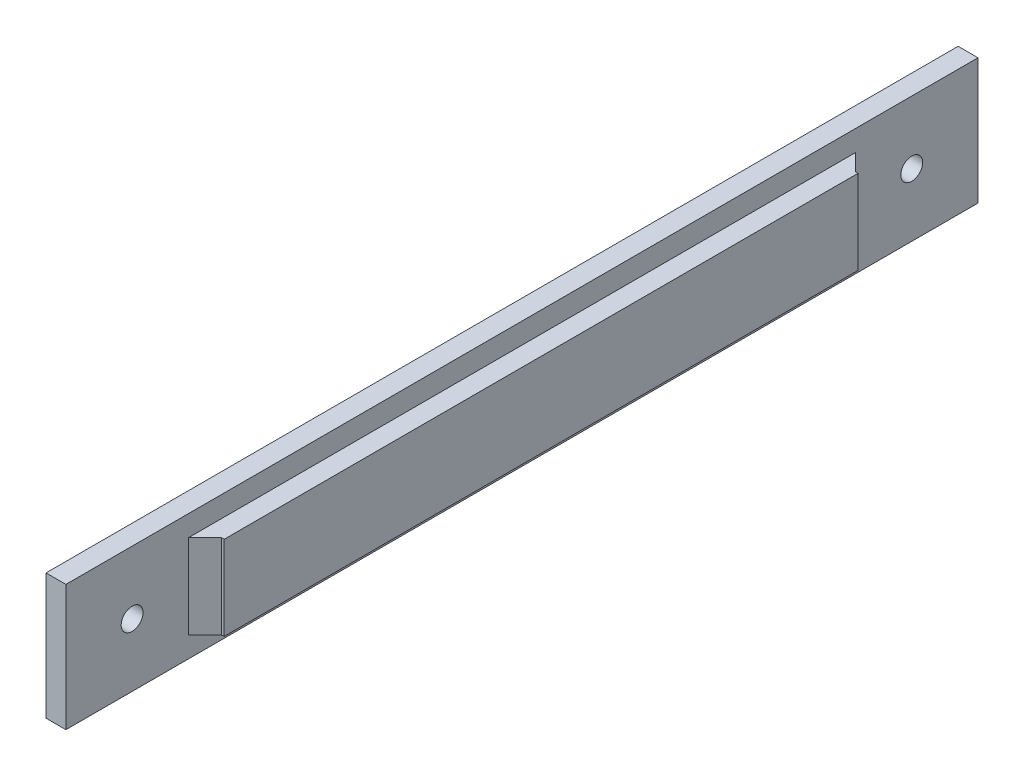
ISO-10303-21;
HEADER;
FILE_DESCRIPTION(('STEP AP214'),'2;1');
FILE_NAME('part.step','',(''),(''),'','','');
FILE_SCHEMA(('AUTOMOTIVE_DESIGN { 1 0 10303 214 1 1 1 1 }'));
ENDSEC;
DATA;
#1=APPLICATION_CONTEXT('core data for automotive mechanical design processes');
#2=APPLICATION_PROTOCOL_DEFINITION('international standard','automotive_design',2000,#1);
#3=PRODUCT_CONTEXT('',#1,'mechanical');
#4=PRODUCT('Part','Part','',(#3));
#5=PRODUCT_RELATED_PRODUCT_CATEGORY('part','',(#4));
#6=PRODUCT_DEFINITION_FORMATION('','',#4);
#7=PRODUCT_DEFINITION_CONTEXT('part definition',#1,'design');
#8=PRODUCT_DEFINITION('design','',#6,#7);
#9=PRODUCT_DEFINITION_SHAPE('','',#8);
#10=(LENGTH_UNIT() NAMED_UNIT(*) SI_UNIT(.MILLI.,.METRE.));
#11=(NAMED_UNIT(*) PLANE_ANGLE_UNIT() SI_UNIT($,.RADIAN.));
#12=(NAMED_UNIT(*) SI_UNIT($,.STERADIAN.) SOLID_ANGLE_UNIT());
#13=UNCERTAINTY_MEASURE_WITH_UNIT(LENGTH_MEASURE(1.E-05),#10,'distance_accuracy_value','');
#14=(GEOMETRIC_REPRESENTATION_CONTEXT(3) GLOBAL_UNCERTAINTY_ASSIGNED_CONTEXT((#13)) GLOBAL_UNIT_ASSIGNED_CONTEXT((#10,
#11,#12)) REPRESENTATION_CONTEXT('',''));
#15=CARTESIAN_POINT('',(0.,0.,0.));
#16=DIRECTION('',(0.,0.,1.));
#17=DIRECTION('',(1.,0.,0.));
#18=AXIS2_PLACEMENT_3D('',#15,#16,#17);
#19=CARTESIAN_POINT('',(0.,0.,137.7));
#20=DIRECTION('',(0.,0.,1.));
#21=DIRECTION('',(1.,0.,0.));
#22=AXIS2_PLACEMENT_3D('',#19,#20,#21);
#23=PLANE('',#22);
#24=DIRECTION('',(1.,0.,0.));
#25=VECTOR('',#24,1.);
#26=CARTESIAN_POINT('',(0.,-3.,137.7));
#27=LINE('',#26,#25);
#28=CARTESIAN_POINT('',(-3.,-3.,137.7));
#29=VERTEX_POINT('',#28);
#30=CARTESIAN_POINT('',(0.,-3.,137.7));
#31=VERTEX_POINT('',#30);
#32=EDGE_CURVE('E192',#29,#31,#27,.T.);
#33=ORIENTED_EDGE('',*,*,#32,.T.);
#34=DIRECTION('',(0.,-1.,0.));
#35=VECTOR('',#34,1.);
#36=CARTESIAN_POINT('',(0.,0.,137.7));
#37=LINE('',#36,#35);
#38=CARTESIAN_POINT('',(0.,16.,137.7));
#39=VERTEX_POINT('',#38);
#40=EDGE_CURVE('E185',#39,#31,#37,.T.);
#41=ORIENTED_EDGE('',*,*,#40,.F.);
#42=DIRECTION('',(-1.,0.,0.));
#43=VECTOR('',#42,1.);
#44=CARTESIAN_POINT('',(0.,16.,137.7));
#45=LINE('',#44,#43);
#46=CARTESIAN_POINT('',(-3.,16.,137.7));
#47=VERTEX_POINT('',#46);
#48=EDGE_CURVE('E196',#39,#47,#45,.T.);
#49=ORIENTED_EDGE('',*,*,#48,.T.);
#50=DIRECTION('',(0.,-1.,0.));
#51=VECTOR('',#50,1.);
#52=CARTESIAN_POINT('',(-3.,0.,137.7));
#53=LINE('',#52,#51);
#54=EDGE_CURVE('E189',#47,#29,#53,.T.);
#55=ORIENTED_EDGE('',*,*,#54,.T.);
#56=EDGE_LOOP('',(#33,#41,#49,#55));
#57=FACE_BOUND('',#56,.T.);
#58=ADVANCED_FACE('F62',(#57),#23,.T.);
#59=CARTESIAN_POINT('',(0.,0.,0.));
#60=DIRECTION('',(0.,0.,1.));
#61=DIRECTION('',(1.,0.,0.));
#62=AXIS2_PLACEMENT_3D('',#59,#60,#61);
#63=PLANE('',#62);
#64=DIRECTION('',(0.,-1.,0.));
#65=VECTOR('',#64,1.);
#66=CARTESIAN_POINT('',(0.,0.,0.));
#67=LINE('',#66,#65);
#68=CARTESIAN_POINT('',(0.,16.,0.));
#69=VERTEX_POINT('',#68);
#70=CARTESIAN_POINT('',(0.,-3.,0.));
#71=VERTEX_POINT('',#70);
#72=EDGE_CURVE('E184',#69,#71,#67,.T.);
#73=ORIENTED_EDGE('',*,*,#72,.T.);
#74=DIRECTION('',(1.,0.,0.));
#75=VECTOR('',#74,1.);
#76=CARTESIAN_POINT('',(0.,-3.,0.));
#77=LINE('',#76,#75);
#78=CARTESIAN_POINT('',(-3.,-3.,0.));
#79=VERTEX_POINT('',#78);
#80=EDGE_CURVE('E201',#79,#71,#77,.T.);
#81=ORIENTED_EDGE('',*,*,#80,.F.);
#82=DIRECTION('',(0.,-1.,0.));
#83=VECTOR('',#82,1.);
#84=CARTESIAN_POINT('',(-3.,0.,0.));
#85=LINE('',#84,#83);
#86=CARTESIAN_POINT('',(-3.,16.,0.));
#87=VERTEX_POINT('',#86);
#88=EDGE_CURVE('E187',#87,#79,#85,.T.);
#89=ORIENTED_EDGE('',*,*,#88,.F.);
#90=DIRECTION('',(-1.,0.,0.));
#91=VECTOR('',#90,1.);
#92=CARTESIAN_POINT('',(0.,16.,0.));
#93=LINE('',#92,#91);
#94=EDGE_CURVE('E193',#69,#87,#93,.T.);
#95=ORIENTED_EDGE('',*,*,#94,.F.);
#96=EDGE_LOOP('',(#73,#81,#89,#95));
#97=FACE_BOUND('',#96,.T.);
#98=ADVANCED_FACE('F253',(#97),#63,.F.);
#99=CARTESIAN_POINT('',(0.,-3.,137.7));
#100=DIRECTION('',(0.,1.,0.));
#101=DIRECTION('',(0.,0.,1.));
#102=AXIS2_PLACEMENT_3D('',#99,#100,#101);
#103=PLANE('',#102);
#104=DIRECTION('',(0.,0.,-1.));
#105=VECTOR('',#104,1.);
#106=CARTESIAN_POINT('',(0.,-3.,137.7));
#107=LINE('',#106,#105);
#108=EDGE_CURVE('E161',#31,#71,#107,.T.);
#109=ORIENTED_EDGE('',*,*,#108,.F.);
#110=ORIENTED_EDGE('',*,*,#32,.F.);
#111=DIRECTION('',(0.,0.,-1.));
#112=VECTOR('',#111,1.);
#113=CARTESIAN_POINT('',(-3.,-3.,137.7));
#114=LINE('',#113,#112);
#115=EDGE_CURVE('E207',#29,#79,#114,.T.);
#116=ORIENTED_EDGE('',*,*,#115,.T.);
#117=ORIENTED_EDGE('',*,*,#80,.T.);
#118=EDGE_LOOP('',(#109,#110,#116,#117));
#119=FACE_BOUND('',#118,.T.);
#120=ADVANCED_FACE('F259',(#119),#103,.F.);
#121=CARTESIAN_POINT('',(0.,16.,137.7));
#122=DIRECTION('',(0.,-1.,0.));
#123=DIRECTION('',(0.,0.,-1.));
#124=AXIS2_PLACEMENT_3D('',#121,#122,#123);
#125=PLANE('',#124);
#126=DIRECTION('',(0.,0.,1.));
#127=VECTOR('',#126,1.);
#128=CARTESIAN_POINT('',(0.,16.,137.7));
#129=LINE('',#128,#127);
#130=EDGE_CURVE('E164',#69,#39,#129,.T.);
#131=ORIENTED_EDGE('',*,*,#130,.F.);
#132=ORIENTED_EDGE('',*,*,#94,.T.);
#133=DIRECTION('',(0.,0.,-1.));
#134=VECTOR('',#133,1.);
#135=CARTESIAN_POINT('',(-3.,16.,137.7));
#136=LINE('',#135,#134);
#137=EDGE_CURVE('E198',#47,#87,#136,.T.);
#138=ORIENTED_EDGE('',*,*,#137,.F.);
#139=ORIENTED_EDGE('',*,*,#48,.F.);
#140=EDGE_LOOP('',(#131,#132,#138,#139));
#141=FACE_BOUND('',#140,.T.);
#142=ADVANCED_FACE('F265',(#141),#125,.F.);
#143=CARTESIAN_POINT('',(-3.,0.,137.7));
#144=DIRECTION('',(1.,0.,0.));
#145=DIRECTION('',(0.,0.,-1.));
#146=AXIS2_PLACEMENT_3D('',#143,#144,#145);
#147=PLANE('',#146);
#148=CARTESIAN_POINT('',(-3.,6.5,10.));
#149=DIRECTION('',(-1.,0.,0.));
#150=DIRECTION('',(0.,0.,1.));
#151=AXIS2_PLACEMENT_3D('',#148,#149,#150);
#152=CIRCLE('',#151,1.65);
#153=CARTESIAN_POINT('',(-3.,6.5,11.65));
#154=VERTEX_POINT('',#153);
#155=EDGE_CURVE('E173',#154,#154,#152,.T.);
#156=ORIENTED_EDGE('',*,*,#155,.F.);
#157=EDGE_LOOP('',(#156));
#158=FACE_BOUND('',#157,.T.);
#159=CARTESIAN_POINT('',(-3.,6.5,127.7));
#160=DIRECTION('',(-1.,0.,0.));
#161=DIRECTION('',(0.,0.,1.));
#162=AXIS2_PLACEMENT_3D('',#159,#160,#161);
#163=CIRCLE('',#162,1.65000000000002);
#164=CARTESIAN_POINT('',(-3.,6.5,129.35));
#165=VERTEX_POINT('',#164);
#166=EDGE_CURVE('E172',#165,#165,#163,.T.);
#167=ORIENTED_EDGE('',*,*,#166,.F.);
#168=EDGE_LOOP('',(#167));
#169=FACE_BOUND('',#168,.T.);
#170=ORIENTED_EDGE('',*,*,#88,.T.);
#171=ORIENTED_EDGE('',*,*,#115,.F.);
#172=ORIENTED_EDGE('',*,*,#54,.F.);
#173=ORIENTED_EDGE('',*,*,#137,.T.);
#174=EDGE_LOOP('',(#170,#171,#172,#173));
#175=FACE_BOUND('',#174,.T.);
#176=ADVANCED_FACE('F268',(#158,#169,#175),#147,.F.);
#177=CARTESIAN_POINT('',(0.,0.,137.7));
#178=DIRECTION('',(1.,0.,0.));
#179=DIRECTION('',(0.,0.,-1.));
#180=AXIS2_PLACEMENT_3D('',#177,#178,#179);
#181=PLANE('',#180);
#182=DIRECTION('',(0.,0.,1.));
#183=VECTOR('',#182,1.);
#184=CARTESIAN_POINT('',(0.,12.85,116.7));
#185=LINE('',#184,#183);
#186=CARTESIAN_POINT('',(0.,12.85,18.5));
#187=VERTEX_POINT('',#186);
#188=CARTESIAN_POINT('',(0.,12.85,119.2));
#189=VERTEX_POINT('',#188);
#190=EDGE_CURVE('E157',#187,#189,#185,.T.);
#191=ORIENTED_EDGE('',*,*,#190,.F.);
#192=DIRECTION('',(0.,-1.,0.));
#193=VECTOR('',#192,1.);
#194=CARTESIAN_POINT('',(0.,0.,18.5));
#195=LINE('',#194,#193);
#196=CARTESIAN_POINT('',(0.,0.15000000000002,18.5));
#197=VERTEX_POINT('',#196);
#198=EDGE_CURVE('E216',#187,#197,#195,.T.);
#199=ORIENTED_EDGE('',*,*,#198,.T.);
#200=DIRECTION('',(0.,0.,-1.));
#201=VECTOR('',#200,1.);
#202=CARTESIAN_POINT('',(0.,0.14999999999997,116.7));
#203=LINE('',#202,#201);
#204=CARTESIAN_POINT('',(0.,0.149999999999968,119.2));
#205=VERTEX_POINT('',#204);
#206=EDGE_CURVE('E224',#205,#197,#203,.T.);
#207=ORIENTED_EDGE('',*,*,#206,.F.);
#208=DIRECTION('',(0.,1.,0.));
#209=VECTOR('',#208,1.);
#210=CARTESIAN_POINT('',(0.,0.,119.2));
#211=LINE('',#210,#209);
#212=EDGE_CURVE('E213',#205,#189,#211,.T.);
#213=ORIENTED_EDGE('',*,*,#212,.T.);
#214=EDGE_LOOP('',(#191,#199,#207,#213));
#215=FACE_BOUND('',#214,.T.);
#216=CARTESIAN_POINT('',(0.,6.5,10.));
#217=DIRECTION('',(1.,0.,0.));
#218=DIRECTION('',(0.,0.,-1.));
#219=AXIS2_PLACEMENT_3D('',#216,#217,#218);
#220=CIRCLE('',#219,1.65);
#221=CARTESIAN_POINT('',(0.,6.5,11.65));
#222=VERTEX_POINT('',#221);
#223=EDGE_CURVE('E181',#222,#222,#220,.T.);
#224=ORIENTED_EDGE('',*,*,#223,.F.);
#225=EDGE_LOOP('',(#224));
#226=FACE_BOUND('',#225,.T.);
#227=CARTESIAN_POINT('',(0.,6.5,127.7));
#228=DIRECTION('',(1.,0.,0.));
#229=DIRECTION('',(0.,0.,-1.));
#230=AXIS2_PLACEMENT_3D('',#227,#228,#229);
#231=CIRCLE('',#230,1.65000000000002);
#232=CARTESIAN_POINT('',(0.,6.5,129.35));
#233=VERTEX_POINT('',#232);
#234=EDGE_CURVE('E176',#233,#233,#231,.T.);
#235=ORIENTED_EDGE('',*,*,#234,.F.);
#236=EDGE_LOOP('',(#235));
#237=FACE_BOUND('',#236,.T.);
#238=ORIENTED_EDGE('',*,*,#72,.F.);
#239=ORIENTED_EDGE('',*,*,#130,.T.);
#240=ORIENTED_EDGE('',*,*,#40,.T.);
#241=ORIENTED_EDGE('',*,*,#108,.T.);
#242=EDGE_LOOP('',(#238,#239,#240,#241));
#243=FACE_BOUND('',#242,.T.);
#244=ADVANCED_FACE('F226',(#215,#226,#237,#243),#181,.T.);
#245=CARTESIAN_POINT('',(27.,6.5,127.7));
#246=DIRECTION('',(-1.,0.,0.));
#247=DIRECTION('',(0.,0.,1.));
#248=AXIS2_PLACEMENT_3D('',#245,#246,#247);
#249=CYLINDRICAL_SURFACE('',#248,1.65000000000002);
#250=CARTESIAN_POINT('',(0.,6.5,129.35));
#251=CARTESIAN_POINT('',(-0.0312500000000035,6.5,129.35));
#252=CARTESIAN_POINT('',(-0.0625000000000035,6.5,129.35));
#253=CARTESIAN_POINT('',(-0.125000000000004,6.5,129.35));
#254=CARTESIAN_POINT('',(-0.156250000000004,6.5,129.35));
#255=CARTESIAN_POINT('',(-0.218750000000004,6.5,129.35));
#256=CARTESIAN_POINT('',(-0.250000000000004,6.5,129.35));
#257=CARTESIAN_POINT('',(-0.312500000000004,6.5,129.35));
#258=CARTESIAN_POINT('',(-0.343750000000004,6.5,129.35));
#259=CARTESIAN_POINT('',(-0.406250000000004,6.5,129.35));
#260=CARTESIAN_POINT('',(-0.437500000000004,6.5,129.35));
#261=CARTESIAN_POINT('',(-0.500000000000004,6.5,129.35));
#262=CARTESIAN_POINT('',(-0.531250000000004,6.5,129.35));
#263=CARTESIAN_POINT('',(-0.593750000000004,6.5,129.35));
#264=CARTESIAN_POINT('',(-0.625000000000004,6.5,129.35));
#265=CARTESIAN_POINT('',(-0.687500000000004,6.5,129.35));
#266=CARTESIAN_POINT('',(-0.718750000000004,6.5,129.35));
#267=CARTESIAN_POINT('',(-0.781250000000003,6.5,129.35));
#268=CARTESIAN_POINT('',(-0.812500000000002,6.5,129.35));
#269=CARTESIAN_POINT('',(-0.875000000000001,6.5,129.35));
#270=CARTESIAN_POINT('',(-0.906250000000001,6.5,129.35));
#271=CARTESIAN_POINT('',(-0.968750000000001,6.5,129.35));
#272=CARTESIAN_POINT('',(-1.,6.5,129.35));
#273=CARTESIAN_POINT('',(-1.0625,6.5,129.35));
#274=CARTESIAN_POINT('',(-1.09375,6.5,129.35));
#275=CARTESIAN_POINT('',(-1.15625,6.5,129.35));
#276=CARTESIAN_POINT('',(-1.1875,6.5,129.35));
#277=CARTESIAN_POINT('',(-1.25,6.5,129.35));
#278=CARTESIAN_POINT('',(-1.28125,6.5,129.35));
#279=CARTESIAN_POINT('',(-1.34375,6.5,129.35));
#280=CARTESIAN_POINT('',(-1.375,6.5,129.35));
#281=CARTESIAN_POINT('',(-1.4375,6.5,129.35));
#282=CARTESIAN_POINT('',(-1.46875,6.5,129.35));
#283=CARTESIAN_POINT('',(-1.53125,6.5,129.35));
#284=CARTESIAN_POINT('',(-1.5625,6.5,129.35));
#285=CARTESIAN_POINT('',(-1.625,6.5,129.35));
#286=CARTESIAN_POINT('',(-1.65625,6.5,129.35));
#287=CARTESIAN_POINT('',(-1.71875,6.5,129.35));
#288=CARTESIAN_POINT('',(-1.75,6.5,129.35));
#289=CARTESIAN_POINT('',(-1.8125,6.5,129.35));
#290=CARTESIAN_POINT('',(-1.84375,6.5,129.35));
#291=CARTESIAN_POINT('',(-1.90625,6.5,129.35));
#292=CARTESIAN_POINT('',(-1.9375,6.5,129.35));
#293=CARTESIAN_POINT('',(-2.,6.5,129.35));
#294=CARTESIAN_POINT('',(-2.03125,6.5,129.35));
#295=CARTESIAN_POINT('',(-2.09375,6.5,129.35));
#296=CARTESIAN_POINT('',(-2.125,6.5,129.35));
#297=CARTESIAN_POINT('',(-2.1875,6.5,129.35));
#298=CARTESIAN_POINT('',(-2.21875,6.5,129.35));
#299=CARTESIAN_POINT('',(-2.28125,6.5,129.35));
#300=CARTESIAN_POINT('',(-2.3125,6.5,129.35));
#301=CARTESIAN_POINT('',(-2.375,6.5,129.35));
#302=CARTESIAN_POINT('',(-2.40625,6.5,129.35));
#303=CARTESIAN_POINT('',(-2.46875,6.5,129.35));
#304=CARTESIAN_POINT('',(-2.5,6.5,129.35));
#305=CARTESIAN_POINT('',(-2.5625,6.5,129.35));
#306=CARTESIAN_POINT('',(-2.59375,6.5,129.35));
#307=CARTESIAN_POINT('',(-2.65625,6.5,129.35));
#308=CARTESIAN_POINT('',(-2.6875,6.5,129.35));
#309=CARTESIAN_POINT('',(-2.75,6.5,129.35));
#310=CARTESIAN_POINT('',(-2.78125,6.5,129.35));
#311=CARTESIAN_POINT('',(-2.84375,6.5,129.35));
#312=CARTESIAN_POINT('',(-2.875,6.5,129.35));
#313=CARTESIAN_POINT('',(-2.9375,6.5,129.35));
#314=CARTESIAN_POINT('',(-2.96875,6.5,129.35));
#315=CARTESIAN_POINT('',(-3.,6.5,129.35));
#316=B_SPLINE_CURVE_WITH_KNOTS('',3,(#250,#251,#252,#253,#254,#255,#256,#257,#258,#259,#260,
#261,#262,#263,#264,#265,#266,#267,#268,#269,#270,#271,#272,#273,#274,#275,#276,#277,#278,#279,
#280,#281,#282,#283,#284,#285,#286,#287,#288,#289,#290,#291,#292,#293,#294,#295,#296,#297,#298,
#299,#300,#301,#302,#303,#304,#305,#306,#307,#308,#309,#310,#311,#312,#313,#314,#315),
.UNSPECIFIED.,.F.,.F.,(4,2,2,2,2,2,2,2,2,2,2,2,2,2,2,2,2,2,2,2,2,2,2,2,2,2,2,2,2,2,2,2,4),(0.,
0.0937500000000001,0.1875,0.28125,0.375,0.46875,0.5625,0.656250000000001,0.750000000000001,
0.843749999999997,0.937499999999997,1.03125,1.125,1.21875,1.3125,1.40625,1.5,1.59375,1.6875,
1.78125,1.875,1.96875,2.0625,2.15625,2.25,2.34375,2.4375,2.53125,2.625,2.71875,2.8125,2.90625,
3.),.UNSPECIFIED.);
#317=EDGE_CURVE('BSEAM277',#233,#165,#316,.T.);
#318=ORIENTED_EDGE('',*,*,#234,.T.);
#319=ORIENTED_EDGE('',*,*,#166,.T.);
#320=ORIENTED_EDGE('',*,*,#317,.T.);
#321=ORIENTED_EDGE('',*,*,#317,.F.);
#322=EDGE_LOOP('',(#318,#320,#319,#321));
#323=FACE_BOUND('',#322,.T.);
#324=ADVANCED_FACE('F277',(#323),#249,.F.);
#325=CARTESIAN_POINT('',(27.,6.5,10.));
#326=DIRECTION('',(-1.,0.,0.));
#327=DIRECTION('',(0.,0.,1.));
#328=AXIS2_PLACEMENT_3D('',#325,#326,#327);
#329=CYLINDRICAL_SURFACE('',#328,1.65);
#330=CARTESIAN_POINT('',(0.,6.5,11.65));
#331=CARTESIAN_POINT('',(-0.0312500000000035,6.5,11.65));
#332=CARTESIAN_POINT('',(-0.0625000000000035,6.5,11.65));
#333=CARTESIAN_POINT('',(-0.125000000000004,6.5,11.65));
#334=CARTESIAN_POINT('',(-0.156250000000004,6.5,11.65));
#335=CARTESIAN_POINT('',(-0.218750000000004,6.5,11.65));
#336=CARTESIAN_POINT('',(-0.250000000000004,6.5,11.65));
#337=CARTESIAN_POINT('',(-0.312500000000004,6.5,11.65));
#338=CARTESIAN_POINT('',(-0.343750000000004,6.5,11.65));
#339=CARTESIAN_POINT('',(-0.406250000000004,6.5,11.65));
#340=CARTESIAN_POINT('',(-0.437500000000004,6.5,11.65));
#341=CARTESIAN_POINT('',(-0.500000000000004,6.5,11.65));
#342=CARTESIAN_POINT('',(-0.531250000000004,6.5,11.65));
#343=CARTESIAN_POINT('',(-0.593750000000004,6.5,11.65));
#344=CARTESIAN_POINT('',(-0.625000000000004,6.5,11.65));
#345=CARTESIAN_POINT('',(-0.687500000000004,6.5,11.65));
#346=CARTESIAN_POINT('',(-0.718750000000004,6.5,11.65));
#347=CARTESIAN_POINT('',(-0.781250000000003,6.5,11.65));
#348=CARTESIAN_POINT('',(-0.812500000000002,6.5,11.65));
#349=CARTESIAN_POINT('',(-0.875000000000001,6.5,11.65));
#350=CARTESIAN_POINT('',(-0.906250000000001,6.5,11.65));
#351=CARTESIAN_POINT('',(-0.968750000000001,6.5,11.65));
#352=CARTESIAN_POINT('',(-1.,6.5,11.65));
#353=CARTESIAN_POINT('',(-1.0625,6.5,11.65));
#354=CARTESIAN_POINT('',(-1.09375,6.5,11.65));
#355=CARTESIAN_POINT('',(-1.15625,6.5,11.65));
#356=CARTESIAN_POINT('',(-1.1875,6.5,11.65));
#357=CARTESIAN_POINT('',(-1.25,6.5,11.65));
#358=CARTESIAN_POINT('',(-1.28125,6.5,11.65));
#359=CARTESIAN_POINT('',(-1.34375,6.5,11.65));
#360=CARTESIAN_POINT('',(-1.375,6.5,11.65));
#361=CARTESIAN_POINT('',(-1.4375,6.5,11.65));
#362=CARTESIAN_POINT('',(-1.46875,6.5,11.65));
#363=CARTESIAN_POINT('',(-1.53125,6.5,11.65));
#364=CARTESIAN_POINT('',(-1.5625,6.5,11.65));
#365=CARTESIAN_POINT('',(-1.625,6.5,11.65));
#366=CARTESIAN_POINT('',(-1.65625,6.5,11.65));
#367=CARTESIAN_POINT('',(-1.71875,6.5,11.65));
#368=CARTESIAN_POINT('',(-1.75,6.5,11.65));
#369=CARTESIAN_POINT('',(-1.8125,6.5,11.65));
#370=CARTESIAN_POINT('',(-1.84375,6.5,11.65));
#371=CARTESIAN_POINT('',(-1.90625,6.5,11.65));
#372=CARTESIAN_POINT('',(-1.9375,6.5,11.65));
#373=CARTESIAN_POINT('',(-2.,6.5,11.65));
#374=CARTESIAN_POINT('',(-2.03125,6.5,11.65));
#375=CARTESIAN_POINT('',(-2.09375,6.5,11.65));
#376=CARTESIAN_POINT('',(-2.125,6.5,11.65));
#377=CARTESIAN_POINT('',(-2.1875,6.5,11.65));
#378=CARTESIAN_POINT('',(-2.21875,6.5,11.65));
#379=CARTESIAN_POINT('',(-2.28125,6.5,11.65));
#380=CARTESIAN_POINT('',(-2.3125,6.5,11.65));
#381=CARTESIAN_POINT('',(-2.375,6.5,11.65));
#382=CARTESIAN_POINT('',(-2.40625,6.5,11.65));
#383=CARTESIAN_POINT('',(-2.46875,6.5,11.65));
#384=CARTESIAN_POINT('',(-2.5,6.5,11.65));
#385=CARTESIAN_POINT('',(-2.5625,6.5,11.65));
#386=CARTESIAN_POINT('',(-2.59375,6.5,11.65));
#387=CARTESIAN_POINT('',(-2.65625,6.5,11.65));
#388=CARTESIAN_POINT('',(-2.6875,6.5,11.65));
#389=CARTESIAN_POINT('',(-2.75,6.5,11.65));
#390=CARTESIAN_POINT('',(-2.78125,6.5,11.65));
#391=CARTESIAN_POINT('',(-2.84375,6.5,11.65));
#392=CARTESIAN_POINT('',(-2.875,6.5,11.65));
#393=CARTESIAN_POINT('',(-2.9375,6.5,11.65));
#394=CARTESIAN_POINT('',(-2.96875,6.5,11.65));
#395=CARTESIAN_POINT('',(-3.,6.5,11.65));
#396=B_SPLINE_CURVE_WITH_KNOTS('',3,(#330,#331,#332,#333,#334,#335,#336,#337,#338,#339,#340,
#341,#342,#343,#344,#345,#346,#347,#348,#349,#350,#351,#352,#353,#354,#355,#356,#357,#358,#359,
#360,#361,#362,#363,#364,#365,#366,#367,#368,#369,#370,#371,#372,#373,#374,#375,#376,#377,#378,
#379,#380,#381,#382,#383,#384,#385,#386,#387,#388,#389,#390,#391,#392,#393,#394,#395),
.UNSPECIFIED.,.F.,.F.,(4,2,2,2,2,2,2,2,2,2,2,2,2,2,2,2,2,2,2,2,2,2,2,2,2,2,2,2,2,2,2,2,4),(0.,
0.0937500000000001,0.1875,0.28125,0.375,0.46875,0.5625,0.656250000000001,0.750000000000001,
0.843749999999997,0.937499999999997,1.03125,1.125,1.21875,1.3125,1.40625,1.5,1.59375,1.6875,
1.78125,1.875,1.96875,2.0625,2.15625,2.25,2.34375,2.4375,2.53125,2.625,2.71875,2.8125,2.90625,
3.),.UNSPECIFIED.);
#397=EDGE_CURVE('BSEAM293',#222,#154,#396,.T.);
#398=ORIENTED_EDGE('',*,*,#223,.T.);
#399=ORIENTED_EDGE('',*,*,#155,.T.);
#400=ORIENTED_EDGE('',*,*,#397,.T.);
#401=ORIENTED_EDGE('',*,*,#397,.F.);
#402=EDGE_LOOP('',(#398,#400,#399,#401));
#403=FACE_BOUND('',#402,.T.);
#404=ADVANCED_FACE('F293',(#403),#329,.F.);
#405=CARTESIAN_POINT('',(2.9,12.85,116.7));
#406=DIRECTION('',(0.,0.,-1.));
#407=DIRECTION('',(-1.,0.,0.));
#408=AXIS2_PLACEMENT_3D('',#405,#406,#407);
#409=PLANE('',#408);
#410=DIRECTION('',(-1.,0.,0.));
#411=VECTOR('',#410,1.);
#412=CARTESIAN_POINT('',(2.9,12.85,116.7));
#413=LINE('',#412,#411);
#414=CARTESIAN_POINT('',(2.9,12.85,116.7));
#415=VERTEX_POINT('',#414);
#416=CARTESIAN_POINT('',(2.49999999999999,12.85,116.7));
#417=VERTEX_POINT('',#416);
#418=EDGE_CURVE('E235',#415,#417,#413,.T.);
#419=ORIENTED_EDGE('',*,*,#418,.T.);
#420=DIRECTION('',(0.,-1.,0.));
#421=VECTOR('',#420,1.);
#422=CARTESIAN_POINT('',(2.49999999999999,12.85,116.7));
#423=LINE('',#422,#421);
#424=CARTESIAN_POINT('',(2.49999999999999,0.14999999999997,116.7));
#425=VERTEX_POINT('',#424);
#426=EDGE_CURVE('E160',#417,#425,#423,.T.);
#427=ORIENTED_EDGE('',*,*,#426,.T.);
#428=DIRECTION('',(-1.,0.,0.));
#429=VECTOR('',#428,1.);
#430=CARTESIAN_POINT('',(2.9,0.14999999999997,116.7));
#431=LINE('',#430,#429);
#432=CARTESIAN_POINT('',(2.9,0.14999999999997,116.7));
#433=VERTEX_POINT('',#432);
#434=EDGE_CURVE('E144',#433,#425,#431,.T.);
#435=ORIENTED_EDGE('',*,*,#434,.F.);
#436=DIRECTION('',(0.,-1.,0.));
#437=VECTOR('',#436,1.);
#438=CARTESIAN_POINT('',(2.9,12.85,116.7));
#439=LINE('',#438,#437);
#440=EDGE_CURVE('E150',#415,#433,#439,.T.);
#441=ORIENTED_EDGE('',*,*,#440,.F.);
#442=EDGE_LOOP('',(#419,#427,#435,#441));
#443=FACE_BOUND('',#442,.T.);
#444=ADVANCED_FACE('F159',(#443),#409,.F.);
#445=CARTESIAN_POINT('',(2.9,0.14999999999997,116.7));
#446=DIRECTION('',(0.,1.,0.));
#447=DIRECTION('',(0.,0.,1.));
#448=AXIS2_PLACEMENT_3D('',#445,#446,#447);
#449=PLANE('',#448);
#450=ORIENTED_EDGE('',*,*,#206,.T.);
#451=DIRECTION('',(0.707106781186553,0.,0.707106781186542));
#452=VECTOR('',#451,1.);
#453=CARTESIAN_POINT('',(50.55,0.149999999999994,69.0499999999992));
#454=LINE('',#453,#452);
#455=CARTESIAN_POINT('',(2.5,0.150000000000019,21.));
#456=VERTEX_POINT('',#455);
#457=EDGE_CURVE('E223',#197,#456,#454,.T.);
#458=ORIENTED_EDGE('',*,*,#457,.T.);
#459=DIRECTION('',(-1.,0.,0.));
#460=VECTOR('',#459,1.);
#461=CARTESIAN_POINT('',(2.9,0.150000000000019,21.));
#462=LINE('',#461,#460);
#463=CARTESIAN_POINT('',(2.9,0.150000000000019,21.));
#464=VERTEX_POINT('',#463);
#465=EDGE_CURVE('E146',#464,#456,#462,.T.);
#466=ORIENTED_EDGE('',*,*,#465,.F.);
#467=DIRECTION('',(0.,0.,-1.));
#468=VECTOR('',#467,1.);
#469=CARTESIAN_POINT('',(2.9,0.14999999999997,116.7));
#470=LINE('',#469,#468);
#471=EDGE_CURVE('E140',#433,#464,#470,.T.);
#472=ORIENTED_EDGE('',*,*,#471,.F.);
#473=ORIENTED_EDGE('',*,*,#434,.T.);
#474=DIRECTION('',(-0.707106781186551,0.,0.707106781186544));
#475=VECTOR('',#474,1.);
#476=CARTESIAN_POINT('',(2.7,0.14999999999997,116.5));
#477=LINE('',#476,#475);
#478=EDGE_CURVE('E71',#425,#205,#477,.T.);
#479=ORIENTED_EDGE('',*,*,#478,.T.);
#480=EDGE_LOOP('',(#450,#458,#466,#472,#473,#479));
#481=FACE_BOUND('',#480,.T.);
#482=ADVANCED_FACE('F142',(#481),#449,.F.);
#483=CARTESIAN_POINT('',(2.9,12.85,21.));
#484=DIRECTION('',(0.,0.,1.));
#485=DIRECTION('',(0.,-1.,0.));
#486=AXIS2_PLACEMENT_3D('',#483,#484,#485);
#487=PLANE('',#486);
#488=ORIENTED_EDGE('',*,*,#465,.T.);
#489=DIRECTION('',(0.,1.,0.));
#490=VECTOR('',#489,1.);
#491=CARTESIAN_POINT('',(2.5,12.85,21.));
#492=LINE('',#491,#490);
#493=CARTESIAN_POINT('',(2.5,12.85,21.));
#494=VERTEX_POINT('',#493);
#495=EDGE_CURVE('E210',#456,#494,#492,.T.);
#496=ORIENTED_EDGE('',*,*,#495,.T.);
#497=DIRECTION('',(-1.,0.,0.));
#498=VECTOR('',#497,1.);
#499=CARTESIAN_POINT('',(2.9,12.85,21.));
#500=LINE('',#499,#498);
#501=CARTESIAN_POINT('',(2.9,12.85,21.));
#502=VERTEX_POINT('',#501);
#503=EDGE_CURVE('E166',#502,#494,#500,.T.);
#504=ORIENTED_EDGE('',*,*,#503,.F.);
#505=DIRECTION('',(0.,1.,0.));
#506=VECTOR('',#505,1.);
#507=CARTESIAN_POINT('',(2.9,12.85,21.));
#508=LINE('',#507,#506);
#509=EDGE_CURVE('E149',#464,#502,#508,.T.);
#510=ORIENTED_EDGE('',*,*,#509,.F.);
#511=EDGE_LOOP('',(#488,#496,#504,#510));
#512=FACE_BOUND('',#511,.T.);
#513=ADVANCED_FACE('F240',(#512),#487,.F.);
#514=CARTESIAN_POINT('',(2.9,12.85,116.7));
#515=DIRECTION('',(0.,-1.,0.));
#516=DIRECTION('',(0.,0.,-1.));
#517=AXIS2_PLACEMENT_3D('',#514,#515,#516);
#518=PLANE('',#517);
#519=ORIENTED_EDGE('',*,*,#190,.T.);
#520=DIRECTION('',(0.707106781186551,0.,-0.707106781186544));
#521=VECTOR('',#520,1.);
#522=CARTESIAN_POINT('',(2.7,12.85,116.5));
#523=LINE('',#522,#521);
#524=EDGE_CURVE('E12',#189,#417,#523,.T.);
#525=ORIENTED_EDGE('',*,*,#524,.T.);
#526=ORIENTED_EDGE('',*,*,#418,.F.);
#527=DIRECTION('',(0.,0.,1.));
#528=VECTOR('',#527,1.);
#529=CARTESIAN_POINT('',(2.9,12.85,116.7));
#530=LINE('',#529,#528);
#531=EDGE_CURVE('E155',#502,#415,#530,.T.);
#532=ORIENTED_EDGE('',*,*,#531,.F.);
#533=ORIENTED_EDGE('',*,*,#503,.T.);
#534=DIRECTION('',(-0.707106781186553,0.,-0.707106781186542));
#535=VECTOR('',#534,1.);
#536=CARTESIAN_POINT('',(50.55,12.85,69.0499999999992));
#537=LINE('',#536,#535);
#538=EDGE_CURVE('E220',#494,#187,#537,.T.);
#539=ORIENTED_EDGE('',*,*,#538,.T.);
#540=EDGE_LOOP('',(#519,#525,#526,#532,#533,#539));
#541=FACE_BOUND('',#540,.T.);
#542=ADVANCED_FACE('F238',(#541),#518,.F.);
#543=CARTESIAN_POINT('',(2.9,0.,0.));
#544=DIRECTION('',(1.,0.,0.));
#545=DIRECTION('',(0.,0.,-1.));
#546=AXIS2_PLACEMENT_3D('',#543,#544,#545);
#547=PLANE('',#546);
#548=ORIENTED_EDGE('',*,*,#440,.T.);
#549=ORIENTED_EDGE('',*,*,#471,.T.);
#550=ORIENTED_EDGE('',*,*,#509,.T.);
#551=ORIENTED_EDGE('',*,*,#531,.T.);
#552=EDGE_LOOP('',(#548,#549,#550,#551));
#553=FACE_BOUND('',#552,.T.);
#554=ADVANCED_FACE('F153',(#553),#547,.T.);
#555=CARTESIAN_POINT('',(2.5,12.85,21.));
#556=DIRECTION('',(-0.707106781186542,0.,0.707106781186553));
#557=DIRECTION('',(0.,1.,0.));
#558=AXIS2_PLACEMENT_3D('',#555,#556,#557);
#559=PLANE('',#558);
#560=ORIENTED_EDGE('',*,*,#457,.F.);
#561=ORIENTED_EDGE('',*,*,#198,.F.);
#562=ORIENTED_EDGE('',*,*,#538,.F.);
#563=ORIENTED_EDGE('',*,*,#495,.F.);
#564=EDGE_LOOP('',(#560,#561,#562,#563));
#565=FACE_BOUND('',#564,.T.);
#566=ADVANCED_FACE('F243',(#565),#559,.F.);
#567=CARTESIAN_POINT('',(2.49999999999999,12.85,116.7));
#568=DIRECTION('',(-0.707106781186544,0.,-0.707106781186551));
#569=DIRECTION('',(0.,-1.,0.));
#570=AXIS2_PLACEMENT_3D('',#567,#568,#569);
#571=PLANE('',#570);
#572=ORIENTED_EDGE('',*,*,#524,.F.);
#573=ORIENTED_EDGE('',*,*,#212,.F.);
#574=ORIENTED_EDGE('',*,*,#478,.F.);
#575=ORIENTED_EDGE('',*,*,#426,.F.);
#576=EDGE_LOOP('',(#572,#573,#574,#575));
#577=FACE_BOUND('',#576,.T.);
#578=ADVANCED_FACE('F65',(#577),#571,.F.);
#579=CLOSED_SHELL('',(#58,#98,#120,#142,#176,#244,#324,#404,#444,#482,#513,#542,#554,#566,#578));
#580=MANIFOLD_SOLID_BREP('B2',#579);
#581=ADVANCED_BREP_SHAPE_REPRESENTATION('',(#18,#580),#14);
#582=SHAPE_DEFINITION_REPRESENTATION(#9,#581);
ENDSEC;
END-ISO-10303-21;
